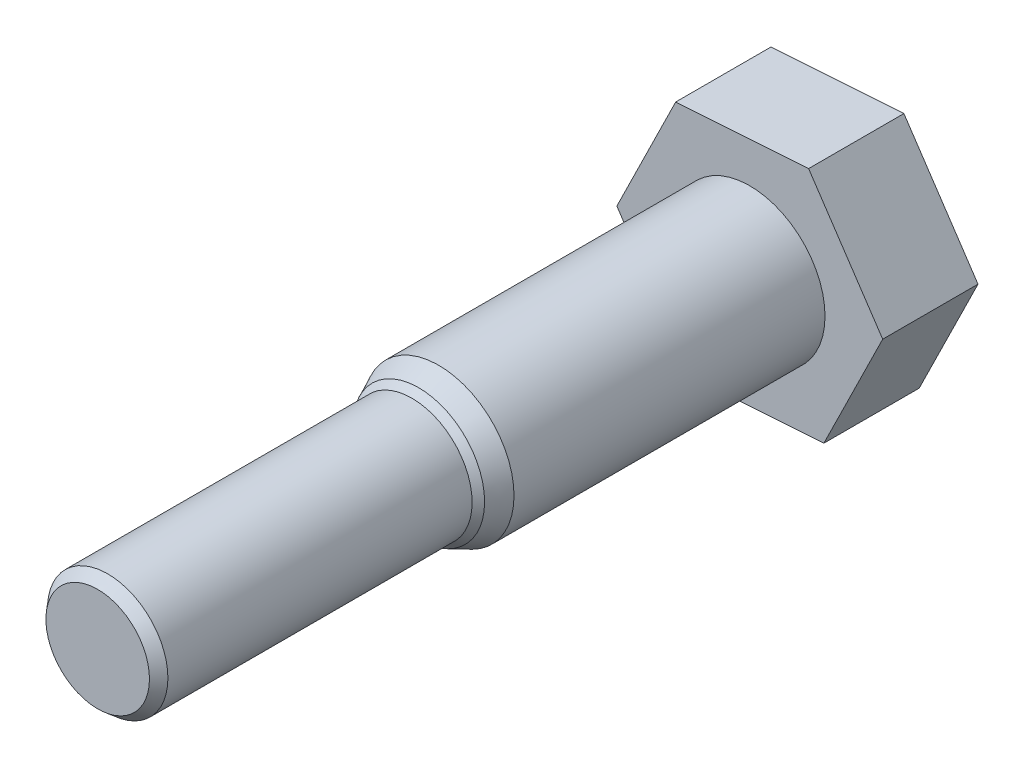
ISO-10303-21;
HEADER;
FILE_DESCRIPTION(('STEP AP214'),'2;1');
FILE_NAME('part.step','',(''),(''),'','','');
FILE_SCHEMA(('AUTOMOTIVE_DESIGN { 1 0 10303 214 1 1 1 1 }'));
ENDSEC;
DATA;
#1=APPLICATION_CONTEXT('core data for automotive mechanical design processes');
#2=APPLICATION_PROTOCOL_DEFINITION('international standard','automotive_design',2000,#1);
#3=PRODUCT_CONTEXT('',#1,'mechanical');
#4=PRODUCT('Part','Part','',(#3));
#5=PRODUCT_RELATED_PRODUCT_CATEGORY('part','',(#4));
#6=PRODUCT_DEFINITION_FORMATION('','',#4);
#7=PRODUCT_DEFINITION_CONTEXT('part definition',#1,'design');
#8=PRODUCT_DEFINITION('design','',#6,#7);
#9=PRODUCT_DEFINITION_SHAPE('','',#8);
#10=(LENGTH_UNIT() NAMED_UNIT(*) SI_UNIT(.MILLI.,.METRE.));
#11=(NAMED_UNIT(*) PLANE_ANGLE_UNIT() SI_UNIT($,.RADIAN.));
#12=(NAMED_UNIT(*) SI_UNIT($,.STERADIAN.) SOLID_ANGLE_UNIT());
#13=UNCERTAINTY_MEASURE_WITH_UNIT(LENGTH_MEASURE(1.E-05),#10,'distance_accuracy_value','');
#14=(GEOMETRIC_REPRESENTATION_CONTEXT(3) GLOBAL_UNCERTAINTY_ASSIGNED_CONTEXT((#13)) GLOBAL_UNIT_ASSIGNED_CONTEXT((#10,
#11,#12)) REPRESENTATION_CONTEXT('',''));
#15=CARTESIAN_POINT('',(0.,0.,0.));
#16=DIRECTION('',(0.,0.,1.));
#17=DIRECTION('',(1.,0.,0.));
#18=AXIS2_PLACEMENT_3D('',#15,#16,#17);
#19=CARTESIAN_POINT('',(14.7706906325746,-22.0717020542165,19.));
#20=DIRECTION('',(0.,0.,1.));
#21=DIRECTION('',(1.,0.,0.));
#22=AXIS2_PLACEMENT_3D('',#19,#20,#21);
#23=PLANE('',#22);
#24=DIRECTION('',(0.997811878273375,0.0661169840249835,0.));
#25=VECTOR('',#24,1.);
#26=CARTESIAN_POINT('',(-11.7293093674254,-23.8276443463587,19.));
#27=LINE('',#26,#25);
#28=CARTESIAN_POINT('',(-11.7293093674254,-23.8276443463587,19.));
#29=VERTEX_POINT('',#28);
#30=CARTESIAN_POINT('',(14.7706906325746,-22.0717020542165,19.));
#31=VERTEX_POINT('',#30);
#32=EDGE_CURVE('E129',#29,#31,#27,.T.);
#33=ORIENTED_EDGE('',*,*,#32,.T.);
#34=DIRECTION('',(0.441646951349442,0.8971889267951,0.));
#35=VECTOR('',#34,1.);
#36=CARTESIAN_POINT('',(14.7706906325746,-22.0717020542165,19.));
#37=LINE('',#36,#35);
#38=CARTESIAN_POINT('',(26.5,1.7559422921422,19.));
#39=VERTEX_POINT('',#38);
#40=EDGE_CURVE('E87',#31,#39,#37,.T.);
#41=ORIENTED_EDGE('',*,*,#40,.T.);
#42=DIRECTION('',(-0.556164926923933,0.831071942770117,0.));
#43=VECTOR('',#42,1.);
#44=CARTESIAN_POINT('',(26.5,1.7559422921422,19.));
#45=LINE('',#44,#43);
#46=CARTESIAN_POINT('',(11.7293093674254,23.8276443463587,19.));
#47=VERTEX_POINT('',#46);
#48=EDGE_CURVE('E100',#39,#47,#45,.T.);
#49=ORIENTED_EDGE('',*,*,#48,.T.);
#50=DIRECTION('',(-0.997811878273375,-0.0661169840249832,0.));
#51=VECTOR('',#50,1.);
#52=CARTESIAN_POINT('',(11.7293093674254,23.8276443463587,19.));
#53=LINE('',#52,#51);
#54=CARTESIAN_POINT('',(-14.7706906325746,22.0717020542165,19.));
#55=VERTEX_POINT('',#54);
#56=EDGE_CURVE('E94',#47,#55,#53,.T.);
#57=ORIENTED_EDGE('',*,*,#56,.T.);
#58=DIRECTION('',(-0.441646951349442,-0.8971889267951,0.));
#59=VECTOR('',#58,1.);
#60=CARTESIAN_POINT('',(-14.7706906325746,22.0717020542165,19.));
#61=LINE('',#60,#59);
#62=CARTESIAN_POINT('',(-26.5,-1.75594229214218,19.));
#63=VERTEX_POINT('',#62);
#64=EDGE_CURVE('E98',#55,#63,#61,.T.);
#65=ORIENTED_EDGE('',*,*,#64,.T.);
#66=DIRECTION('',(0.556164926923933,-0.831071942770117,0.));
#67=VECTOR('',#66,1.);
#68=CARTESIAN_POINT('',(-26.5,-1.75594229214218,19.));
#69=LINE('',#68,#67);
#70=EDGE_CURVE('E49',#63,#29,#69,.T.);
#71=ORIENTED_EDGE('',*,*,#70,.T.);
#72=EDGE_LOOP('',(#33,#41,#49,#57,#65,#71));
#73=FACE_BOUND('',#72,.T.);
#74=CARTESIAN_POINT('',(0.,0.,19.));
#75=DIRECTION('',(0.,0.,1.));
#76=DIRECTION('',(1.,0.,0.));
#77=AXIS2_PLACEMENT_3D('',#74,#75,#76);
#78=CIRCLE('',#77,15.);
#79=CARTESIAN_POINT('',(15.,0.,19.));
#80=VERTEX_POINT('',#79);
#81=EDGE_CURVE('E148',#80,#80,#78,.T.);
#82=ORIENTED_EDGE('',*,*,#81,.F.);
#83=EDGE_LOOP('',(#82));
#84=FACE_BOUND('',#83,.T.);
#85=ADVANCED_FACE('F32',(#73,#84),#23,.T.);
#86=CARTESIAN_POINT('',(-11.7293093674254,-23.8276443463587,19.));
#87=DIRECTION('',(-0.0661169840249835,0.997811878273375,0.));
#88=DIRECTION('',(-0.997811878273375,-0.0661169840249835,0.));
#89=AXIS2_PLACEMENT_3D('',#86,#87,#88);
#90=PLANE('',#89);
#91=DIRECTION('',(0.997811878273375,0.0661169840249835,0.));
#92=VECTOR('',#91,1.);
#93=CARTESIAN_POINT('',(-11.7293093674254,-23.8276443463587,0.));
#94=LINE('',#93,#92);
#95=CARTESIAN_POINT('',(-11.7293093674254,-23.8276443463587,0.));
#96=VERTEX_POINT('',#95);
#97=CARTESIAN_POINT('',(14.7706906325746,-22.0717020542165,0.));
#98=VERTEX_POINT('',#97);
#99=EDGE_CURVE('E118',#96,#98,#94,.T.);
#100=ORIENTED_EDGE('',*,*,#99,.T.);
#101=DIRECTION('',(0.,0.,-1.));
#102=VECTOR('',#101,1.);
#103=CARTESIAN_POINT('',(14.7706906325746,-22.0717020542165,19.));
#104=LINE('',#103,#102);
#105=EDGE_CURVE('E41',#31,#98,#104,.T.);
#106=ORIENTED_EDGE('',*,*,#105,.F.);
#107=ORIENTED_EDGE('',*,*,#32,.F.);
#108=DIRECTION('',(0.,0.,-1.));
#109=VECTOR('',#108,1.);
#110=CARTESIAN_POINT('',(-11.7293093674254,-23.8276443463587,19.));
#111=LINE('',#110,#109);
#112=EDGE_CURVE('E114',#29,#96,#111,.T.);
#113=ORIENTED_EDGE('',*,*,#112,.T.);
#114=EDGE_LOOP('',(#100,#106,#107,#113));
#115=FACE_BOUND('',#114,.T.);
#116=ADVANCED_FACE('F140',(#115),#90,.F.);
#117=CARTESIAN_POINT('',(14.7706906325746,-22.0717020542165,19.));
#118=DIRECTION('',(-0.8971889267951,0.441646951349442,0.));
#119=DIRECTION('',(-0.441646951349442,-0.8971889267951,0.));
#120=AXIS2_PLACEMENT_3D('',#117,#118,#119);
#121=PLANE('',#120);
#122=DIRECTION('',(0.441646951349442,0.8971889267951,0.));
#123=VECTOR('',#122,1.);
#124=CARTESIAN_POINT('',(14.7706906325746,-22.0717020542165,0.));
#125=LINE('',#124,#123);
#126=CARTESIAN_POINT('',(26.5,1.7559422921422,0.));
#127=VERTEX_POINT('',#126);
#128=EDGE_CURVE('E121',#98,#127,#125,.T.);
#129=ORIENTED_EDGE('',*,*,#128,.T.);
#130=DIRECTION('',(0.,0.,-1.));
#131=VECTOR('',#130,1.);
#132=CARTESIAN_POINT('',(26.5,1.7559422921422,19.));
#133=LINE('',#132,#131);
#134=EDGE_CURVE('E133',#39,#127,#133,.T.);
#135=ORIENTED_EDGE('',*,*,#134,.F.);
#136=ORIENTED_EDGE('',*,*,#40,.F.);
#137=ORIENTED_EDGE('',*,*,#105,.T.);
#138=EDGE_LOOP('',(#129,#135,#136,#137));
#139=FACE_BOUND('',#138,.T.);
#140=ADVANCED_FACE('F136',(#139),#121,.F.);
#141=CARTESIAN_POINT('',(26.5,1.7559422921422,19.));
#142=DIRECTION('',(-0.831071942770117,-0.556164926923933,0.));
#143=DIRECTION('',(0.556164926923933,-0.831071942770117,0.));
#144=AXIS2_PLACEMENT_3D('',#141,#142,#143);
#145=PLANE('',#144);
#146=DIRECTION('',(-0.556164926923933,0.831071942770117,0.));
#147=VECTOR('',#146,1.);
#148=CARTESIAN_POINT('',(26.5,1.7559422921422,0.));
#149=LINE('',#148,#147);
#150=CARTESIAN_POINT('',(11.7293093674254,23.8276443463587,0.));
#151=VERTEX_POINT('',#150);
#152=EDGE_CURVE('E124',#127,#151,#149,.T.);
#153=ORIENTED_EDGE('',*,*,#152,.T.);
#154=DIRECTION('',(0.,0.,-1.));
#155=VECTOR('',#154,1.);
#156=CARTESIAN_POINT('',(11.7293093674254,23.8276443463587,19.));
#157=LINE('',#156,#155);
#158=EDGE_CURVE('E109',#47,#151,#157,.T.);
#159=ORIENTED_EDGE('',*,*,#158,.F.);
#160=ORIENTED_EDGE('',*,*,#48,.F.);
#161=ORIENTED_EDGE('',*,*,#134,.T.);
#162=EDGE_LOOP('',(#153,#159,#160,#161));
#163=FACE_BOUND('',#162,.T.);
#164=ADVANCED_FACE('F144',(#163),#145,.F.);
#165=CARTESIAN_POINT('',(11.7293093674254,23.8276443463587,19.));
#166=DIRECTION('',(0.0661169840249832,-0.997811878273375,0.));
#167=DIRECTION('',(0.997811878273375,0.0661169840249832,0.));
#168=AXIS2_PLACEMENT_3D('',#165,#166,#167);
#169=PLANE('',#168);
#170=DIRECTION('',(-0.997811878273375,-0.0661169840249832,0.));
#171=VECTOR('',#170,1.);
#172=CARTESIAN_POINT('',(11.7293093674254,23.8276443463587,0.));
#173=LINE('',#172,#171);
#174=CARTESIAN_POINT('',(-14.7706906325746,22.0717020542165,0.));
#175=VERTEX_POINT('',#174);
#176=EDGE_CURVE('E108',#151,#175,#173,.T.);
#177=ORIENTED_EDGE('',*,*,#176,.T.);
#178=DIRECTION('',(0.,0.,-1.));
#179=VECTOR('',#178,1.);
#180=CARTESIAN_POINT('',(-14.7706906325746,22.0717020542165,19.));
#181=LINE('',#180,#179);
#182=EDGE_CURVE('E105',#55,#175,#181,.T.);
#183=ORIENTED_EDGE('',*,*,#182,.F.);
#184=ORIENTED_EDGE('',*,*,#56,.F.);
#185=ORIENTED_EDGE('',*,*,#158,.T.);
#186=EDGE_LOOP('',(#177,#183,#184,#185));
#187=FACE_BOUND('',#186,.T.);
#188=ADVANCED_FACE('F106',(#187),#169,.F.);
#189=CARTESIAN_POINT('',(-14.7706906325746,22.0717020542165,19.));
#190=DIRECTION('',(0.8971889267951,-0.441646951349442,0.));
#191=DIRECTION('',(0.441646951349442,0.8971889267951,0.));
#192=AXIS2_PLACEMENT_3D('',#189,#190,#191);
#193=PLANE('',#192);
#194=DIRECTION('',(-0.441646951349442,-0.8971889267951,0.));
#195=VECTOR('',#194,1.);
#196=CARTESIAN_POINT('',(-14.7706906325746,22.0717020542165,0.));
#197=LINE('',#196,#195);
#198=CARTESIAN_POINT('',(-26.5,-1.75594229214218,0.));
#199=VERTEX_POINT('',#198);
#200=EDGE_CURVE('E72',#175,#199,#197,.T.);
#201=ORIENTED_EDGE('',*,*,#200,.T.);
#202=DIRECTION('',(0.,0.,-1.));
#203=VECTOR('',#202,1.);
#204=CARTESIAN_POINT('',(-26.5,-1.75594229214218,19.));
#205=LINE('',#204,#203);
#206=EDGE_CURVE('E110',#63,#199,#205,.T.);
#207=ORIENTED_EDGE('',*,*,#206,.F.);
#208=ORIENTED_EDGE('',*,*,#64,.F.);
#209=ORIENTED_EDGE('',*,*,#182,.T.);
#210=EDGE_LOOP('',(#201,#207,#208,#209));
#211=FACE_BOUND('',#210,.T.);
#212=ADVANCED_FACE('F112',(#211),#193,.F.);
#213=CARTESIAN_POINT('',(-26.5,-1.75594229214218,19.));
#214=DIRECTION('',(0.831071942770117,0.556164926923933,0.));
#215=DIRECTION('',(-0.556164926923933,0.831071942770117,0.));
#216=AXIS2_PLACEMENT_3D('',#213,#214,#215);
#217=PLANE('',#216);
#218=DIRECTION('',(0.556164926923933,-0.831071942770117,0.));
#219=VECTOR('',#218,1.);
#220=CARTESIAN_POINT('',(-26.5,-1.75594229214218,0.));
#221=LINE('',#220,#219);
#222=EDGE_CURVE('E78',#199,#96,#221,.T.);
#223=ORIENTED_EDGE('',*,*,#222,.T.);
#224=ORIENTED_EDGE('',*,*,#112,.F.);
#225=ORIENTED_EDGE('',*,*,#70,.F.);
#226=ORIENTED_EDGE('',*,*,#206,.T.);
#227=EDGE_LOOP('',(#223,#224,#225,#226));
#228=FACE_BOUND('',#227,.T.);
#229=ADVANCED_FACE('F195',(#228),#217,.F.);
#230=CARTESIAN_POINT('',(0.,0.,0.));
#231=DIRECTION('',(0.,0.,1.));
#232=DIRECTION('',(1.,0.,0.));
#233=AXIS2_PLACEMENT_3D('',#230,#231,#232);
#234=PLANE('',#233);
#235=ORIENTED_EDGE('',*,*,#99,.F.);
#236=ORIENTED_EDGE('',*,*,#222,.F.);
#237=ORIENTED_EDGE('',*,*,#200,.F.);
#238=ORIENTED_EDGE('',*,*,#176,.F.);
#239=ORIENTED_EDGE('',*,*,#152,.F.);
#240=ORIENTED_EDGE('',*,*,#128,.F.);
#241=EDGE_LOOP('',(#235,#236,#237,#238,#239,#240));
#242=FACE_BOUND('',#241,.T.);
#243=ADVANCED_FACE('F34',(#242),#234,.F.);
#244=CARTESIAN_POINT('',(0.,0.,81.));
#245=DIRECTION('',(0.,0.,-1.));
#246=DIRECTION('',(-1.,0.,0.));
#247=AXIS2_PLACEMENT_3D('',#244,#245,#246);
#248=CYLINDRICAL_SURFACE('',#247,15.);
#249=CARTESIAN_POINT('',(0.,0.,81.));
#250=DIRECTION('',(0.,0.,1.));
#251=DIRECTION('',(1.,0.,0.));
#252=AXIS2_PLACEMENT_3D('',#249,#250,#251);
#253=CIRCLE('',#252,15.);
#254=CARTESIAN_POINT('',(15.,0.,81.));
#255=VERTEX_POINT('',#254);
#256=EDGE_CURVE('E122',#255,#255,#253,.T.);
#257=ORIENTED_EDGE('',*,*,#256,.F.);
#258=EDGE_LOOP('',(#257));
#259=FACE_BOUND('',#258,.T.);
#260=ORIENTED_EDGE('',*,*,#81,.T.);
#261=EDGE_LOOP('',(#260));
#262=FACE_BOUND('',#261,.T.);
#263=ADVANCED_FACE('F185',(#259,#262),#248,.T.);
#264=CARTESIAN_POINT('',(0.,0.,81.));
#265=DIRECTION('',(0.,0.,-1.));
#266=DIRECTION('',(1.,0.,0.));
#267=AXIS2_PLACEMENT_3D('',#264,#265,#266);
#268=CONICAL_SURFACE('',#267,15.,0.436332312998583);
#269=CARTESIAN_POINT('',(0.,0.,85.));
#270=DIRECTION('',(0.,0.,1.));
#271=DIRECTION('',(1.,0.,0.));
#272=AXIS2_PLACEMENT_3D('',#269,#270,#271);
#273=CIRCLE('',#272,13.13476936738);
#274=CARTESIAN_POINT('',(13.13476936738,0.,85.));
#275=VERTEX_POINT('',#274);
#276=EDGE_CURVE('E151',#275,#275,#273,.T.);
#277=ORIENTED_EDGE('',*,*,#276,.F.);
#278=EDGE_LOOP('',(#277));
#279=FACE_BOUND('',#278,.T.);
#280=ORIENTED_EDGE('',*,*,#256,.T.);
#281=EDGE_LOOP('',(#280));
#282=FACE_BOUND('',#281,.T.);
#283=ADVANCED_FACE('F179',(#279,#282),#268,.T.);
#284=CARTESIAN_POINT('',(0.,0.,85.));
#285=DIRECTION('',(0.,0.,-1.));
#286=DIRECTION('',(1.,0.,0.));
#287=AXIS2_PLACEMENT_3D('',#284,#285,#286);
#288=CONICAL_SURFACE('',#287,13.13476936738,0.698131700797733);
#289=ORIENTED_EDGE('',*,*,#276,.T.);
#290=EDGE_LOOP('',(#289));
#291=FACE_BOUND('',#290,.T.);
#292=CARTESIAN_POINT('',(0.,0.,86.352365470341));
#293=DIRECTION('',(0.,0.,-1.));
#294=DIRECTION('',(-1.,0.,0.));
#295=AXIS2_PLACEMENT_3D('',#292,#293,#294);
#296=CIRCLE('',#295,12.);
#297=CARTESIAN_POINT('',(-12.,0.,86.352365470341));
#298=VERTEX_POINT('',#297);
#299=EDGE_CURVE('E11',#298,#298,#296,.T.);
#300=ORIENTED_EDGE('',*,*,#299,.T.);
#301=EDGE_LOOP('',(#300));
#302=FACE_BOUND('',#301,.T.);
#303=ADVANCED_FACE('F174',(#291,#302),#288,.T.);
#304=CARTESIAN_POINT('',(0.,0.,147.));
#305=DIRECTION('',(0.,0.,-1.));
#306=DIRECTION('',(-1.,0.,0.));
#307=AXIS2_PLACEMENT_3D('',#304,#305,#306);
#308=CYLINDRICAL_SURFACE('',#307,12.);
#309=CARTESIAN_POINT('',(0.,0.,147.));
#310=DIRECTION('',(0.,0.,1.));
#311=DIRECTION('',(1.,0.,0.));
#312=AXIS2_PLACEMENT_3D('',#309,#310,#311);
#313=CIRCLE('',#312,12.);
#314=CARTESIAN_POINT('',(12.,0.,147.));
#315=VERTEX_POINT('',#314);
#316=EDGE_CURVE('E156',#315,#315,#313,.T.);
#317=ORIENTED_EDGE('',*,*,#316,.F.);
#318=EDGE_LOOP('',(#317));
#319=FACE_BOUND('',#318,.T.);
#320=ORIENTED_EDGE('',*,*,#299,.F.);
#321=EDGE_LOOP('',(#320));
#322=FACE_BOUND('',#321,.T.);
#323=ADVANCED_FACE('F168',(#319,#322),#308,.T.);
#324=CARTESIAN_POINT('',(0.,0.,147.));
#325=DIRECTION('',(0.,0.,-1.));
#326=DIRECTION('',(1.,0.,0.));
#327=AXIS2_PLACEMENT_3D('',#324,#325,#326);
#328=CONICAL_SURFACE('',#327,12.,0.698131700797733);
#329=CARTESIAN_POINT('',(0.,0.,149.));
#330=DIRECTION('',(0.,0.,1.));
#331=DIRECTION('',(1.,0.,0.));
#332=AXIS2_PLACEMENT_3D('',#329,#330,#331);
#333=CIRCLE('',#332,10.3218007376454);
#334=CARTESIAN_POINT('',(10.3218007376454,0.,149.));
#335=VERTEX_POINT('',#334);
#336=EDGE_CURVE('E159',#335,#335,#333,.T.);
#337=ORIENTED_EDGE('',*,*,#336,.F.);
#338=EDGE_LOOP('',(#337));
#339=FACE_BOUND('',#338,.T.);
#340=ORIENTED_EDGE('',*,*,#316,.T.);
#341=EDGE_LOOP('',(#340));
#342=FACE_BOUND('',#341,.T.);
#343=ADVANCED_FACE('F165',(#339,#342),#328,.T.);
#344=CARTESIAN_POINT('',(0.,0.,149.));
#345=DIRECTION('',(0.,0.,1.));
#346=DIRECTION('',(1.,0.,0.));
#347=AXIS2_PLACEMENT_3D('',#344,#345,#346);
#348=PLANE('',#347);
#349=ORIENTED_EDGE('',*,*,#336,.T.);
#350=EDGE_LOOP('',(#349));
#351=FACE_BOUND('',#350,.T.);
#352=ADVANCED_FACE('F163',(#351),#348,.T.);
#353=CLOSED_SHELL('',(#85,#116,#140,#164,#188,#212,#229,#243,#263,#283,#303,#323,#343,#352));
#354=MANIFOLD_SOLID_BREP('B2',#353);
#355=ADVANCED_BREP_SHAPE_REPRESENTATION('',(#18,#354),#14);
#356=SHAPE_DEFINITION_REPRESENTATION(#9,#355);
ENDSEC;
END-ISO-10303-21;
